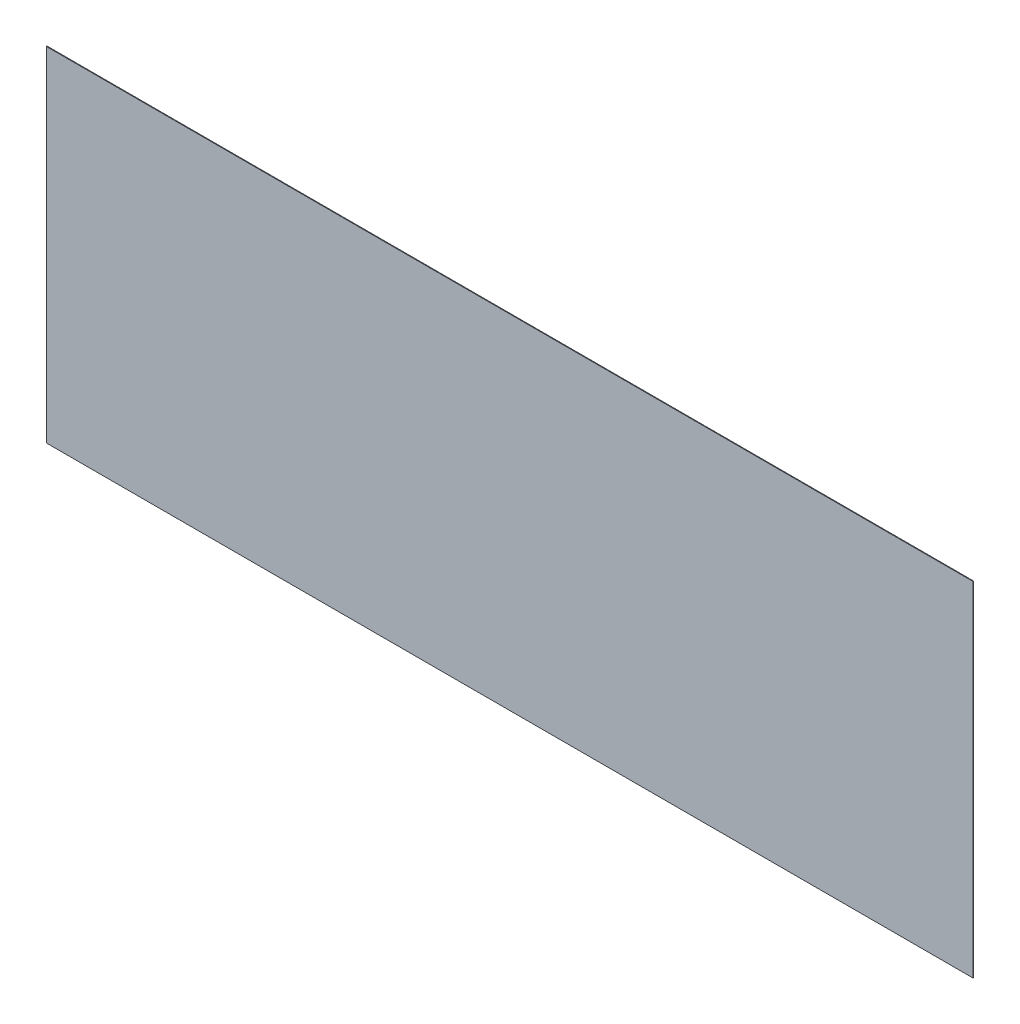
ISO-10303-21;
HEADER;
FILE_DESCRIPTION(('STEP AP214'),'2;1');
FILE_NAME('part.step','',(''),(''),'','','');
FILE_SCHEMA(('AUTOMOTIVE_DESIGN { 1 0 10303 214 1 1 1 1 }'));
ENDSEC;
DATA;
#1=APPLICATION_CONTEXT('core data for automotive mechanical design processes');
#2=APPLICATION_PROTOCOL_DEFINITION('international standard','automotive_design',2000,#1);
#3=PRODUCT_CONTEXT('',#1,'mechanical');
#4=PRODUCT('Part','Part','',(#3));
#5=PRODUCT_RELATED_PRODUCT_CATEGORY('part','',(#4));
#6=PRODUCT_DEFINITION_FORMATION('','',#4);
#7=PRODUCT_DEFINITION_CONTEXT('part definition',#1,'design');
#8=PRODUCT_DEFINITION('design','',#6,#7);
#9=PRODUCT_DEFINITION_SHAPE('','',#8);
#10=(LENGTH_UNIT() NAMED_UNIT(*) SI_UNIT(.MILLI.,.METRE.));
#11=(NAMED_UNIT(*) PLANE_ANGLE_UNIT() SI_UNIT($,.RADIAN.));
#12=(NAMED_UNIT(*) SI_UNIT($,.STERADIAN.) SOLID_ANGLE_UNIT());
#13=UNCERTAINTY_MEASURE_WITH_UNIT(LENGTH_MEASURE(1.E-05),#10,'distance_accuracy_value','');
#14=(GEOMETRIC_REPRESENTATION_CONTEXT(3) GLOBAL_UNCERTAINTY_ASSIGNED_CONTEXT((#13)) GLOBAL_UNIT_ASSIGNED_CONTEXT((#10,
#11,#12)) REPRESENTATION_CONTEXT('',''));
#15=CARTESIAN_POINT('',(0.,0.,0.));
#16=DIRECTION('',(0.,0.,1.));
#17=DIRECTION('',(1.,0.,0.));
#18=AXIS2_PLACEMENT_3D('',#15,#16,#17);
#19=CARTESIAN_POINT('',(137.5,0.,0.1));
#20=DIRECTION('',(-1.,0.,0.));
#21=DIRECTION('',(0.,0.,1.));
#22=AXIS2_PLACEMENT_3D('',#19,#20,#21);
#23=PLANE('',#22);
#24=DIRECTION('',(0.,1.,0.));
#25=VECTOR('',#24,1.);
#26=CARTESIAN_POINT('',(137.5,0.,-0.1));
#27=LINE('',#26,#25);
#28=CARTESIAN_POINT('',(137.5,0.,-0.1));
#29=VERTEX_POINT('',#28);
#30=CARTESIAN_POINT('',(137.5,101.925,-0.1));
#31=VERTEX_POINT('',#30);
#32=EDGE_CURVE('E99',#29,#31,#27,.T.);
#33=ORIENTED_EDGE('',*,*,#32,.T.);
#34=DIRECTION('',(0.,0.,-1.));
#35=VECTOR('',#34,1.);
#36=CARTESIAN_POINT('',(137.5,101.925,0.1));
#37=LINE('',#36,#35);
#38=CARTESIAN_POINT('',(137.5,101.925,0.1));
#39=VERTEX_POINT('',#38);
#40=EDGE_CURVE('E11',#39,#31,#37,.T.);
#41=ORIENTED_EDGE('',*,*,#40,.F.);
#42=DIRECTION('',(0.,1.,0.));
#43=VECTOR('',#42,1.);
#44=CARTESIAN_POINT('',(137.5,0.,0.1));
#45=LINE('',#44,#43);
#46=CARTESIAN_POINT('',(137.5,0.,0.1));
#47=VERTEX_POINT('',#46);
#48=EDGE_CURVE('E87',#47,#39,#45,.T.);
#49=ORIENTED_EDGE('',*,*,#48,.F.);
#50=DIRECTION('',(0.,0.,-1.));
#51=VECTOR('',#50,1.);
#52=CARTESIAN_POINT('',(137.5,0.,0.1));
#53=LINE('',#52,#51);
#54=EDGE_CURVE('E95',#47,#29,#53,.T.);
#55=ORIENTED_EDGE('',*,*,#54,.T.);
#56=EDGE_LOOP('',(#33,#41,#49,#55));
#57=FACE_BOUND('',#56,.T.);
#58=ADVANCED_FACE('F36',(#57),#23,.F.);
#59=CARTESIAN_POINT('',(-137.5,101.925,0.1));
#60=DIRECTION('',(0.,-1.,0.));
#61=DIRECTION('',(1.,0.,0.));
#62=AXIS2_PLACEMENT_3D('',#59,#60,#61);
#63=PLANE('',#62);
#64=DIRECTION('',(-1.,0.,0.));
#65=VECTOR('',#64,1.);
#66=CARTESIAN_POINT('',(-137.5,101.925,-0.1));
#67=LINE('',#66,#65);
#68=CARTESIAN_POINT('',(-137.5,101.925,-0.1));
#69=VERTEX_POINT('',#68);
#70=EDGE_CURVE('E91',#31,#69,#67,.T.);
#71=ORIENTED_EDGE('',*,*,#70,.T.);
#72=DIRECTION('',(0.,0.,-1.));
#73=VECTOR('',#72,1.);
#74=CARTESIAN_POINT('',(-137.5,101.925,0.1));
#75=LINE('',#74,#73);
#76=CARTESIAN_POINT('',(-137.5,101.925,0.1));
#77=VERTEX_POINT('',#76);
#78=EDGE_CURVE('E44',#77,#69,#75,.T.);
#79=ORIENTED_EDGE('',*,*,#78,.F.);
#80=DIRECTION('',(-1.,0.,0.));
#81=VECTOR('',#80,1.);
#82=CARTESIAN_POINT('',(-137.5,101.925,0.1));
#83=LINE('',#82,#81);
#84=EDGE_CURVE('E82',#39,#77,#83,.T.);
#85=ORIENTED_EDGE('',*,*,#84,.F.);
#86=ORIENTED_EDGE('',*,*,#40,.T.);
#87=EDGE_LOOP('',(#71,#79,#85,#86));
#88=FACE_BOUND('',#87,.T.);
#89=ADVANCED_FACE('F90',(#88),#63,.F.);
#90=CARTESIAN_POINT('',(-137.5,0.,0.1));
#91=DIRECTION('',(1.,0.,0.));
#92=DIRECTION('',(0.,1.,0.));
#93=AXIS2_PLACEMENT_3D('',#90,#91,#92);
#94=PLANE('',#93);
#95=DIRECTION('',(0.,-1.,0.));
#96=VECTOR('',#95,1.);
#97=CARTESIAN_POINT('',(-137.5,0.,-0.1));
#98=LINE('',#97,#96);
#99=CARTESIAN_POINT('',(-137.5,0.,-0.1));
#100=VERTEX_POINT('',#99);
#101=EDGE_CURVE('E69',#69,#100,#98,.T.);
#102=ORIENTED_EDGE('',*,*,#101,.T.);
#103=DIRECTION('',(0.,0.,-1.));
#104=VECTOR('',#103,1.);
#105=CARTESIAN_POINT('',(-137.5,0.,0.1));
#106=LINE('',#105,#104);
#107=CARTESIAN_POINT('',(-137.5,0.,0.1));
#108=VERTEX_POINT('',#107);
#109=EDGE_CURVE('E92',#108,#100,#106,.T.);
#110=ORIENTED_EDGE('',*,*,#109,.F.);
#111=DIRECTION('',(0.,-1.,0.));
#112=VECTOR('',#111,1.);
#113=CARTESIAN_POINT('',(-137.5,0.,0.1));
#114=LINE('',#113,#112);
#115=EDGE_CURVE('E85',#77,#108,#114,.T.);
#116=ORIENTED_EDGE('',*,*,#115,.F.);
#117=ORIENTED_EDGE('',*,*,#78,.T.);
#118=EDGE_LOOP('',(#102,#110,#116,#117));
#119=FACE_BOUND('',#118,.T.);
#120=ADVANCED_FACE('F93',(#119),#94,.F.);
#121=CARTESIAN_POINT('',(-137.5,0.,0.1));
#122=DIRECTION('',(0.,1.,0.));
#123=DIRECTION('',(-1.,0.,0.));
#124=AXIS2_PLACEMENT_3D('',#121,#122,#123);
#125=PLANE('',#124);
#126=DIRECTION('',(1.,0.,0.));
#127=VECTOR('',#126,1.);
#128=CARTESIAN_POINT('',(-137.5,0.,-0.1));
#129=LINE('',#128,#127);
#130=EDGE_CURVE('E75',#100,#29,#129,.T.);
#131=ORIENTED_EDGE('',*,*,#130,.T.);
#132=ORIENTED_EDGE('',*,*,#54,.F.);
#133=DIRECTION('',(1.,0.,0.));
#134=VECTOR('',#133,1.);
#135=CARTESIAN_POINT('',(-137.5,0.,0.1));
#136=LINE('',#135,#134);
#137=EDGE_CURVE('E52',#108,#47,#136,.T.);
#138=ORIENTED_EDGE('',*,*,#137,.F.);
#139=ORIENTED_EDGE('',*,*,#109,.T.);
#140=EDGE_LOOP('',(#131,#132,#138,#139));
#141=FACE_BOUND('',#140,.T.);
#142=ADVANCED_FACE('F106',(#141),#125,.F.);
#143=CARTESIAN_POINT('',(0.,0.,0.1));
#144=DIRECTION('',(0.,0.,-1.));
#145=DIRECTION('',(-1.,0.,0.));
#146=AXIS2_PLACEMENT_3D('',#143,#144,#145);
#147=PLANE('',#146);
#148=ORIENTED_EDGE('',*,*,#48,.T.);
#149=ORIENTED_EDGE('',*,*,#84,.T.);
#150=ORIENTED_EDGE('',*,*,#115,.T.);
#151=ORIENTED_EDGE('',*,*,#137,.T.);
#152=EDGE_LOOP('',(#148,#149,#150,#151));
#153=FACE_BOUND('',#152,.T.);
#154=ADVANCED_FACE('F83',(#153),#147,.F.);
#155=CARTESIAN_POINT('',(0.,0.,-0.1));
#156=DIRECTION('',(0.,0.,-1.));
#157=DIRECTION('',(-1.,0.,0.));
#158=AXIS2_PLACEMENT_3D('',#155,#156,#157);
#159=PLANE('',#158);
#160=ORIENTED_EDGE('',*,*,#32,.F.);
#161=ORIENTED_EDGE('',*,*,#130,.F.);
#162=ORIENTED_EDGE('',*,*,#101,.F.);
#163=ORIENTED_EDGE('',*,*,#70,.F.);
#164=EDGE_LOOP('',(#160,#161,#162,#163));
#165=FACE_BOUND('',#164,.T.);
#166=ADVANCED_FACE('F109',(#165),#159,.T.);
#167=CLOSED_SHELL('',(#58,#89,#120,#142,#154,#166));
#168=MANIFOLD_SOLID_BREP('B2',#167);
#169=ADVANCED_BREP_SHAPE_REPRESENTATION('',(#18,#168),#14);
#170=SHAPE_DEFINITION_REPRESENTATION(#9,#169);
ENDSEC;
END-ISO-10303-21;
